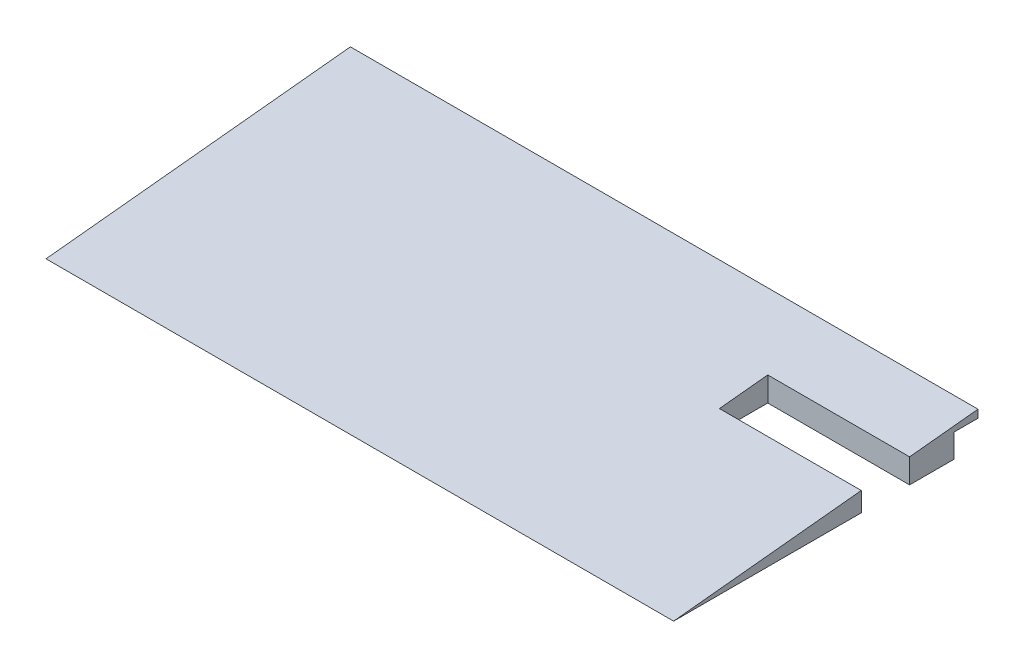
ISO-10303-21;
HEADER;
FILE_DESCRIPTION(('STEP AP214'),'2;1');
FILE_NAME('part.step','',(''),(''),'','','');
FILE_SCHEMA(('AUTOMOTIVE_DESIGN { 1 0 10303 214 1 1 1 1 }'));
ENDSEC;
DATA;
#1=APPLICATION_CONTEXT('core data for automotive mechanical design processes');
#2=APPLICATION_PROTOCOL_DEFINITION('international standard','automotive_design',2000,#1);
#3=PRODUCT_CONTEXT('',#1,'mechanical');
#4=PRODUCT('Part','Part','',(#3));
#5=PRODUCT_RELATED_PRODUCT_CATEGORY('part','',(#4));
#6=PRODUCT_DEFINITION_FORMATION('','',#4);
#7=PRODUCT_DEFINITION_CONTEXT('part definition',#1,'design');
#8=PRODUCT_DEFINITION('design','',#6,#7);
#9=PRODUCT_DEFINITION_SHAPE('','',#8);
#10=(LENGTH_UNIT() NAMED_UNIT(*) SI_UNIT(.MILLI.,.METRE.));
#11=(NAMED_UNIT(*) PLANE_ANGLE_UNIT() SI_UNIT($,.RADIAN.));
#12=(NAMED_UNIT(*) SI_UNIT($,.STERADIAN.) SOLID_ANGLE_UNIT());
#13=UNCERTAINTY_MEASURE_WITH_UNIT(LENGTH_MEASURE(1.E-05),#10,'distance_accuracy_value','');
#14=(GEOMETRIC_REPRESENTATION_CONTEXT(3) GLOBAL_UNCERTAINTY_ASSIGNED_CONTEXT((#13)) GLOBAL_UNIT_ASSIGNED_CONTEXT((#10,
#11,#12)) REPRESENTATION_CONTEXT('',''));
#15=CARTESIAN_POINT('',(0.,0.,0.));
#16=DIRECTION('',(0.,0.,1.));
#17=DIRECTION('',(1.,0.,0.));
#18=AXIS2_PLACEMENT_3D('',#15,#16,#17);
#19=CARTESIAN_POINT('',(100.,0.,-48.5));
#20=DIRECTION('',(0.,1.,0.));
#21=DIRECTION('',(0.,0.,1.));
#22=AXIS2_PLACEMENT_3D('',#19,#20,#21);
#23=PLANE('',#22);
#24=DIRECTION('',(-1.,0.,0.));
#25=VECTOR('',#24,1.);
#26=CARTESIAN_POINT('',(100.,0.,-26.7));
#27=LINE('',#26,#25);
#28=CARTESIAN_POINT('',(100.,0.,-26.7));
#29=VERTEX_POINT('',#28);
#30=CARTESIAN_POINT('',(54.8,0.,-26.7));
#31=VERTEX_POINT('',#30);
#32=EDGE_CURVE('E109',#29,#31,#27,.T.);
#33=ORIENTED_EDGE('',*,*,#32,.T.);
#34=DIRECTION('',(0.,0.,1.));
#35=VECTOR('',#34,1.);
#36=CARTESIAN_POINT('',(54.8,0.,-26.7));
#37=LINE('',#36,#35);
#38=CARTESIAN_POINT('',(54.8,0.,-11.3));
#39=VERTEX_POINT('',#38);
#40=EDGE_CURVE('E119',#31,#39,#37,.T.);
#41=ORIENTED_EDGE('',*,*,#40,.T.);
#42=DIRECTION('',(1.,0.,0.));
#43=VECTOR('',#42,1.);
#44=CARTESIAN_POINT('',(100.,0.,-11.3));
#45=LINE('',#44,#43);
#46=CARTESIAN_POINT('',(100.,0.,-11.3));
#47=VERTEX_POINT('',#46);
#48=EDGE_CURVE('E168',#39,#47,#45,.T.);
#49=ORIENTED_EDGE('',*,*,#48,.T.);
#50=DIRECTION('',(0.,0.,-1.));
#51=VECTOR('',#50,1.);
#52=CARTESIAN_POINT('',(100.,0.,-48.5));
#53=LINE('',#52,#51);
#54=CARTESIAN_POINT('',(100.,0.,48.5));
#55=VERTEX_POINT('',#54);
#56=EDGE_CURVE('E133',#55,#47,#53,.T.);
#57=ORIENTED_EDGE('',*,*,#56,.F.);
#58=DIRECTION('',(-1.,0.,0.));
#59=VECTOR('',#58,1.);
#60=CARTESIAN_POINT('',(100.,0.,48.5));
#61=LINE('',#60,#59);
#62=CARTESIAN_POINT('',(-100.,0.,48.5));
#63=VERTEX_POINT('',#62);
#64=EDGE_CURVE('E147',#55,#63,#61,.T.);
#65=ORIENTED_EDGE('',*,*,#64,.T.);
#66=DIRECTION('',(0.,0.,-1.));
#67=VECTOR('',#66,1.);
#68=CARTESIAN_POINT('',(-100.,0.,-48.5));
#69=LINE('',#68,#67);
#70=CARTESIAN_POINT('',(-100.,0.,-40.8));
#71=VERTEX_POINT('',#70);
#72=EDGE_CURVE('E148',#63,#71,#69,.T.);
#73=ORIENTED_EDGE('',*,*,#72,.T.);
#74=DIRECTION('',(1.,0.,0.));
#75=VECTOR('',#74,1.);
#76=CARTESIAN_POINT('',(-100.,0.,-40.8));
#77=LINE('',#76,#75);
#78=CARTESIAN_POINT('',(100.,0.,-40.8));
#79=VERTEX_POINT('',#78);
#80=EDGE_CURVE('E132',#71,#79,#77,.T.);
#81=ORIENTED_EDGE('',*,*,#80,.T.);
#82=EDGE_CURVE('E125',#29,#79,#53,.T.);
#83=ORIENTED_EDGE('',*,*,#82,.F.);
#84=EDGE_LOOP('',(#33,#41,#49,#57,#65,#73,#81,#83));
#85=FACE_BOUND('',#84,.T.);
#86=ADVANCED_FACE('F40',(#85),#23,.F.);
#87=CARTESIAN_POINT('',(100.,0.,48.5));
#88=DIRECTION('',(0.,-0.994727926154281,-0.102549270737555));
#89=DIRECTION('',(0.,0.102549270737555,-0.994727926154281));
#90=AXIS2_PLACEMENT_3D('',#87,#88,#89);
#91=PLANE('',#90);
#92=DIRECTION('',(-1.,0.,0.));
#93=VECTOR('',#92,1.);
#94=CARTESIAN_POINT('',(100.,7.75257731958762,-26.7));
#95=LINE('',#94,#93);
#96=CARTESIAN_POINT('',(100.,7.75257731958762,-26.7));
#97=VERTEX_POINT('',#96);
#98=CARTESIAN_POINT('',(54.8,7.75257731958762,-26.7));
#99=VERTEX_POINT('',#98);
#100=EDGE_CURVE('E176',#97,#99,#95,.T.);
#101=ORIENTED_EDGE('',*,*,#100,.F.);
#102=DIRECTION('',(0.,-0.102549270737555,0.99472792615428));
#103=VECTOR('',#102,1.);
#104=CARTESIAN_POINT('',(100.,0.,48.5));
#105=LINE('',#104,#103);
#106=CARTESIAN_POINT('',(100.,9.99999999999999,-48.5));
#107=VERTEX_POINT('',#106);
#108=EDGE_CURVE('E128',#107,#97,#105,.T.);
#109=ORIENTED_EDGE('',*,*,#108,.F.);
#110=DIRECTION('',(-1.,0.,0.));
#111=VECTOR('',#110,1.);
#112=CARTESIAN_POINT('',(100.,9.99999999999999,-48.5));
#113=LINE('',#112,#111);
#114=CARTESIAN_POINT('',(-100.,9.99999999999999,-48.5));
#115=VERTEX_POINT('',#114);
#116=EDGE_CURVE('E153',#107,#115,#113,.T.);
#117=ORIENTED_EDGE('',*,*,#116,.T.);
#118=DIRECTION('',(0.,-0.102549270737555,0.99472792615428));
#119=VECTOR('',#118,1.);
#120=CARTESIAN_POINT('',(-100.,0.,48.5));
#121=LINE('',#120,#119);
#122=EDGE_CURVE('E134',#115,#63,#121,.T.);
#123=ORIENTED_EDGE('',*,*,#122,.T.);
#124=ORIENTED_EDGE('',*,*,#64,.F.);
#125=CARTESIAN_POINT('',(100.,6.16494845360823,-11.3));
#126=VERTEX_POINT('',#125);
#127=EDGE_CURVE('E145',#126,#55,#105,.T.);
#128=ORIENTED_EDGE('',*,*,#127,.F.);
#129=DIRECTION('',(1.,0.,0.));
#130=VECTOR('',#129,1.);
#131=CARTESIAN_POINT('',(100.,6.16494845360823,-11.3));
#132=LINE('',#131,#130);
#133=CARTESIAN_POINT('',(54.8,6.16494845360823,-11.3));
#134=VERTEX_POINT('',#133);
#135=EDGE_CURVE('E54',#134,#126,#132,.T.);
#136=ORIENTED_EDGE('',*,*,#135,.F.);
#137=DIRECTION('',(0.,-0.102549270737555,0.994727926154281));
#138=VECTOR('',#137,1.);
#139=CARTESIAN_POINT('',(54.8,0.,48.5));
#140=LINE('',#139,#138);
#141=EDGE_CURVE('E11',#99,#134,#140,.T.);
#142=ORIENTED_EDGE('',*,*,#141,.F.);
#143=EDGE_LOOP('',(#101,#109,#117,#123,#124,#128,#136,#142));
#144=FACE_BOUND('',#143,.T.);
#145=ADVANCED_FACE('F164',(#144),#91,.F.);
#146=CARTESIAN_POINT('',(100.,0.,0.));
#147=DIRECTION('',(1.,0.,0.));
#148=DIRECTION('',(0.,0.,-1.));
#149=AXIS2_PLACEMENT_3D('',#146,#147,#148);
#150=PLANE('',#149);
#151=ORIENTED_EDGE('',*,*,#108,.T.);
#152=DIRECTION('',(0.,-1.,0.));
#153=VECTOR('',#152,1.);
#154=CARTESIAN_POINT('',(100.,0.,-26.7));
#155=LINE('',#154,#153);
#156=EDGE_CURVE('E47',#97,#29,#155,.T.);
#157=ORIENTED_EDGE('',*,*,#156,.T.);
#158=ORIENTED_EDGE('',*,*,#82,.T.);
#159=DIRECTION('',(0.,-1.,0.));
#160=VECTOR('',#159,1.);
#161=CARTESIAN_POINT('',(100.,0.,-40.8));
#162=LINE('',#161,#160);
#163=CARTESIAN_POINT('',(100.,7.5,-40.8));
#164=VERTEX_POINT('',#163);
#165=EDGE_CURVE('E182',#164,#79,#162,.T.);
#166=ORIENTED_EDGE('',*,*,#165,.F.);
#167=DIRECTION('',(0.,0.,1.));
#168=VECTOR('',#167,1.);
#169=CARTESIAN_POINT('',(100.,7.5,-48.5));
#170=LINE('',#169,#168);
#171=CARTESIAN_POINT('',(100.,7.5,-48.5));
#172=VERTEX_POINT('',#171);
#173=EDGE_CURVE('E178',#172,#164,#170,.T.);
#174=ORIENTED_EDGE('',*,*,#173,.F.);
#175=DIRECTION('',(0.,1.,0.));
#176=VECTOR('',#175,1.);
#177=CARTESIAN_POINT('',(100.,9.99999999999999,-48.5));
#178=LINE('',#177,#176);
#179=EDGE_CURVE('E137',#172,#107,#178,.T.);
#180=ORIENTED_EDGE('',*,*,#179,.T.);
#181=EDGE_LOOP('',(#151,#157,#158,#166,#174,#180));
#182=FACE_BOUND('',#181,.T.);
#183=ADVANCED_FACE('F123',(#182),#150,.T.);
#184=ORIENTED_EDGE('',*,*,#56,.T.);
#185=DIRECTION('',(0.,1.,0.));
#186=VECTOR('',#185,1.);
#187=CARTESIAN_POINT('',(100.,0.,-11.3));
#188=LINE('',#187,#186);
#189=EDGE_CURVE('E129',#47,#126,#188,.T.);
#190=ORIENTED_EDGE('',*,*,#189,.T.);
#191=ORIENTED_EDGE('',*,*,#127,.T.);
#192=EDGE_LOOP('',(#184,#190,#191));
#193=FACE_BOUND('',#192,.T.);
#194=ADVANCED_FACE('F158',(#193),#150,.T.);
#195=CARTESIAN_POINT('',(100.,9.99999999999999,-48.5));
#196=DIRECTION('',(0.,0.,1.));
#197=DIRECTION('',(1.,0.,0.));
#198=AXIS2_PLACEMENT_3D('',#195,#196,#197);
#199=PLANE('',#198);
#200=ORIENTED_EDGE('',*,*,#179,.F.);
#201=DIRECTION('',(1.,0.,0.));
#202=VECTOR('',#201,1.);
#203=CARTESIAN_POINT('',(-100.,7.5,-48.5));
#204=LINE('',#203,#202);
#205=CARTESIAN_POINT('',(-100.,7.5,-48.5));
#206=VERTEX_POINT('',#205);
#207=EDGE_CURVE('E142',#206,#172,#204,.T.);
#208=ORIENTED_EDGE('',*,*,#207,.F.);
#209=DIRECTION('',(0.,1.,0.));
#210=VECTOR('',#209,1.);
#211=CARTESIAN_POINT('',(-100.,9.99999999999999,-48.5));
#212=LINE('',#211,#210);
#213=EDGE_CURVE('E138',#206,#115,#212,.T.);
#214=ORIENTED_EDGE('',*,*,#213,.T.);
#215=ORIENTED_EDGE('',*,*,#116,.F.);
#216=EDGE_LOOP('',(#200,#208,#214,#215));
#217=FACE_BOUND('',#216,.T.);
#218=ADVANCED_FACE('F196',(#217),#199,.F.);
#219=CARTESIAN_POINT('',(-100.,0.,0.));
#220=DIRECTION('',(1.,0.,0.));
#221=DIRECTION('',(0.,0.,-1.));
#222=AXIS2_PLACEMENT_3D('',#219,#220,#221);
#223=PLANE('',#222);
#224=DIRECTION('',(0.,0.,1.));
#225=VECTOR('',#224,1.);
#226=CARTESIAN_POINT('',(-100.,7.5,-48.5));
#227=LINE('',#226,#225);
#228=CARTESIAN_POINT('',(-100.,7.5,-40.8));
#229=VERTEX_POINT('',#228);
#230=EDGE_CURVE('E179',#206,#229,#227,.T.);
#231=ORIENTED_EDGE('',*,*,#230,.T.);
#232=DIRECTION('',(0.,-1.,0.));
#233=VECTOR('',#232,1.);
#234=CARTESIAN_POINT('',(-100.,0.,-40.8));
#235=LINE('',#234,#233);
#236=EDGE_CURVE('E62',#229,#71,#235,.T.);
#237=ORIENTED_EDGE('',*,*,#236,.T.);
#238=ORIENTED_EDGE('',*,*,#72,.F.);
#239=ORIENTED_EDGE('',*,*,#122,.F.);
#240=ORIENTED_EDGE('',*,*,#213,.F.);
#241=EDGE_LOOP('',(#231,#237,#238,#239,#240));
#242=FACE_BOUND('',#241,.T.);
#243=ADVANCED_FACE('F217',(#242),#223,.F.);
#244=CARTESIAN_POINT('',(-100.,0.,-40.8));
#245=DIRECTION('',(0.,0.,1.));
#246=DIRECTION('',(1.,0.,0.));
#247=AXIS2_PLACEMENT_3D('',#244,#245,#246);
#248=PLANE('',#247);
#249=ORIENTED_EDGE('',*,*,#165,.T.);
#250=ORIENTED_EDGE('',*,*,#80,.F.);
#251=ORIENTED_EDGE('',*,*,#236,.F.);
#252=DIRECTION('',(1.,0.,0.));
#253=VECTOR('',#252,1.);
#254=CARTESIAN_POINT('',(-100.,7.5,-40.8));
#255=LINE('',#254,#253);
#256=EDGE_CURVE('E187',#229,#164,#255,.T.);
#257=ORIENTED_EDGE('',*,*,#256,.T.);
#258=EDGE_LOOP('',(#249,#250,#251,#257));
#259=FACE_BOUND('',#258,.T.);
#260=ADVANCED_FACE('F223',(#259),#248,.F.);
#261=CARTESIAN_POINT('',(-100.,7.5,-48.5));
#262=DIRECTION('',(0.,1.,0.));
#263=DIRECTION('',(0.,0.,1.));
#264=AXIS2_PLACEMENT_3D('',#261,#262,#263);
#265=PLANE('',#264);
#266=ORIENTED_EDGE('',*,*,#173,.T.);
#267=ORIENTED_EDGE('',*,*,#256,.F.);
#268=ORIENTED_EDGE('',*,*,#230,.F.);
#269=ORIENTED_EDGE('',*,*,#207,.T.);
#270=EDGE_LOOP('',(#266,#267,#268,#269));
#271=FACE_BOUND('',#270,.T.);
#272=ADVANCED_FACE('F191',(#271),#265,.F.);
#273=CARTESIAN_POINT('',(54.8,9.99999999999999,-26.7));
#274=DIRECTION('',(1.,0.,0.));
#275=DIRECTION('',(0.,0.,-1.));
#276=AXIS2_PLACEMENT_3D('',#273,#274,#275);
#277=PLANE('',#276);
#278=ORIENTED_EDGE('',*,*,#141,.T.);
#279=DIRECTION('',(0.,-1.,0.));
#280=VECTOR('',#279,1.);
#281=CARTESIAN_POINT('',(54.8,9.99999999999999,-11.3));
#282=LINE('',#281,#280);
#283=EDGE_CURVE('E169',#134,#39,#282,.T.);
#284=ORIENTED_EDGE('',*,*,#283,.T.);
#285=ORIENTED_EDGE('',*,*,#40,.F.);
#286=DIRECTION('',(0.,-1.,0.));
#287=VECTOR('',#286,1.);
#288=CARTESIAN_POINT('',(54.8,9.99999999999999,-26.7));
#289=LINE('',#288,#287);
#290=EDGE_CURVE('E114',#99,#31,#289,.T.);
#291=ORIENTED_EDGE('',*,*,#290,.F.);
#292=EDGE_LOOP('',(#278,#284,#285,#291));
#293=FACE_BOUND('',#292,.T.);
#294=ADVANCED_FACE('F198',(#293),#277,.T.);
#295=CARTESIAN_POINT('',(100.,9.99999999999999,-26.7));
#296=DIRECTION('',(0.,0.,1.));
#297=DIRECTION('',(1.,0.,0.));
#298=AXIS2_PLACEMENT_3D('',#295,#296,#297);
#299=PLANE('',#298);
#300=ORIENTED_EDGE('',*,*,#100,.T.);
#301=ORIENTED_EDGE('',*,*,#290,.T.);
#302=ORIENTED_EDGE('',*,*,#32,.F.);
#303=ORIENTED_EDGE('',*,*,#156,.F.);
#304=EDGE_LOOP('',(#300,#301,#302,#303));
#305=FACE_BOUND('',#304,.T.);
#306=ADVANCED_FACE('F111',(#305),#299,.T.);
#307=CARTESIAN_POINT('',(100.,9.99999999999999,-11.3));
#308=DIRECTION('',(0.,0.,-1.));
#309=DIRECTION('',(-1.,0.,0.));
#310=AXIS2_PLACEMENT_3D('',#307,#308,#309);
#311=PLANE('',#310);
#312=ORIENTED_EDGE('',*,*,#135,.T.);
#313=ORIENTED_EDGE('',*,*,#189,.F.);
#314=ORIENTED_EDGE('',*,*,#48,.F.);
#315=ORIENTED_EDGE('',*,*,#283,.F.);
#316=EDGE_LOOP('',(#312,#313,#314,#315));
#317=FACE_BOUND('',#316,.T.);
#318=ADVANCED_FACE('F199',(#317),#311,.T.);
#319=CLOSED_SHELL('',(#86,#145,#183,#194,#218,#243,#260,#272,#294,#306,#318));
#320=MANIFOLD_SOLID_BREP('B2',#319);
#321=ADVANCED_BREP_SHAPE_REPRESENTATION('',(#18,#320),#14);
#322=SHAPE_DEFINITION_REPRESENTATION(#9,#321);
ENDSEC;
END-ISO-10303-21;
